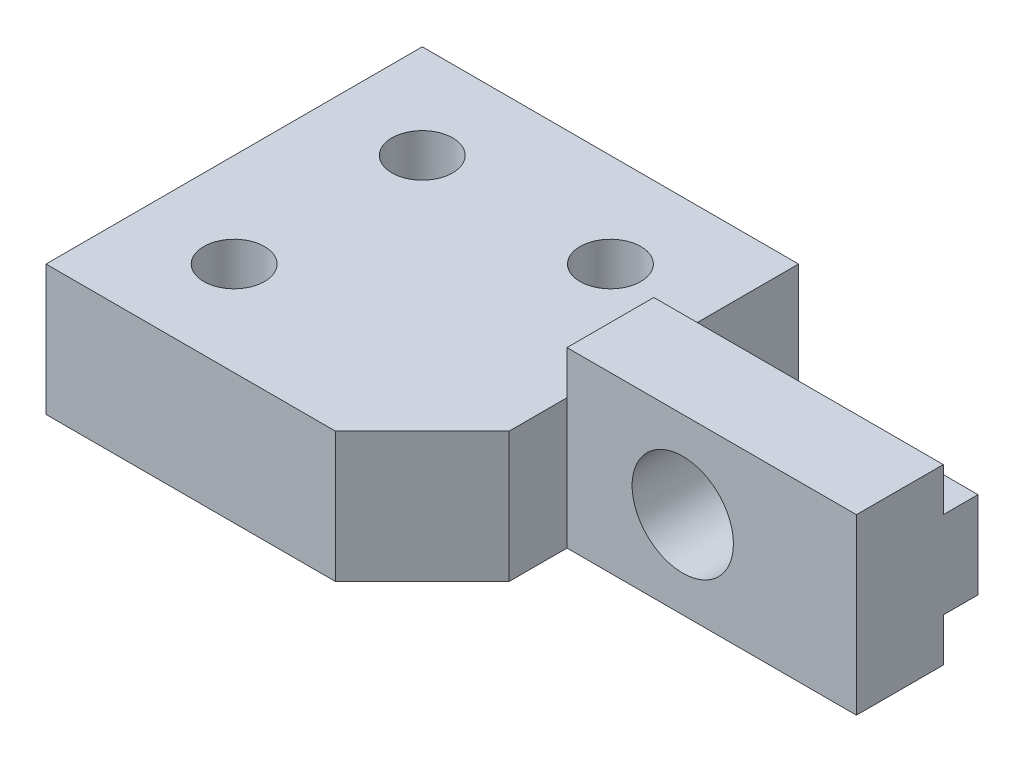
ISO-10303-21;
HEADER;
FILE_DESCRIPTION(('STEP AP214'),'2;1');
FILE_NAME('part.step','',(''),(''),'','','');
FILE_SCHEMA(('AUTOMOTIVE_DESIGN { 1 0 10303 214 1 1 1 1 }'));
ENDSEC;
DATA;
#1=APPLICATION_CONTEXT('core data for automotive mechanical design processes');
#2=APPLICATION_PROTOCOL_DEFINITION('international standard','automotive_design',2000,#1);
#3=PRODUCT_CONTEXT('',#1,'mechanical');
#4=PRODUCT('Part','Part','',(#3));
#5=PRODUCT_RELATED_PRODUCT_CATEGORY('part','',(#4));
#6=PRODUCT_DEFINITION_FORMATION('','',#4);
#7=PRODUCT_DEFINITION_CONTEXT('part definition',#1,'design');
#8=PRODUCT_DEFINITION('design','',#6,#7);
#9=PRODUCT_DEFINITION_SHAPE('','',#8);
#10=(LENGTH_UNIT() NAMED_UNIT(*) SI_UNIT(.MILLI.,.METRE.));
#11=(NAMED_UNIT(*) PLANE_ANGLE_UNIT() SI_UNIT($,.RADIAN.));
#12=(NAMED_UNIT(*) SI_UNIT($,.STERADIAN.) SOLID_ANGLE_UNIT());
#13=UNCERTAINTY_MEASURE_WITH_UNIT(LENGTH_MEASURE(1.E-05),#10,'distance_accuracy_value','');
#14=(GEOMETRIC_REPRESENTATION_CONTEXT(3) GLOBAL_UNCERTAINTY_ASSIGNED_CONTEXT((#13)) GLOBAL_UNIT_ASSIGNED_CONTEXT((#10,
#11,#12)) REPRESENTATION_CONTEXT('',''));
#15=CARTESIAN_POINT('',(0.,0.,0.));
#16=DIRECTION('',(0.,0.,1.));
#17=DIRECTION('',(1.,0.,0.));
#18=AXIS2_PLACEMENT_3D('',#15,#16,#17);
#19=CARTESIAN_POINT('',(16.5,1.5,0.549999999999993));
#20=DIRECTION('',(0.,1.,0.));
#21=DIRECTION('',(0.,0.,1.));
#22=AXIS2_PLACEMENT_3D('',#19,#20,#21);
#23=PLANE('',#22);
#24=DIRECTION('',(-1.,0.,0.));
#25=VECTOR('',#24,1.);
#26=CARTESIAN_POINT('',(16.5,1.5,0.549999999999993));
#27=LINE('',#26,#25);
#28=CARTESIAN_POINT('',(9.598612181134,1.5,0.549999999999993));
#29=VERTEX_POINT('',#28);
#30=CARTESIAN_POINT('',(6.5,1.5,0.549999999999993));
#31=VERTEX_POINT('',#30);
#32=EDGE_CURVE('E63',#29,#31,#27,.T.);
#33=ORIENTED_EDGE('',*,*,#32,.F.);
#34=DIRECTION('',(0.,0.,1.));
#35=VECTOR('',#34,1.);
#36=CARTESIAN_POINT('',(9.598612181134,1.5,-3.25));
#37=LINE('',#36,#35);
#38=CARTESIAN_POINT('',(9.598612181134,1.5,1.74999999999999));
#39=VERTEX_POINT('',#38);
#40=EDGE_CURVE('E332',#29,#39,#37,.T.);
#41=ORIENTED_EDGE('',*,*,#40,.T.);
#42=DIRECTION('',(-1.,0.,0.));
#43=VECTOR('',#42,1.);
#44=CARTESIAN_POINT('',(16.5,1.5,1.74999999999999));
#45=LINE('',#44,#43);
#46=CARTESIAN_POINT('',(6.5,1.5,1.74999999999999));
#47=VERTEX_POINT('',#46);
#48=EDGE_CURVE('E271',#39,#47,#45,.T.);
#49=ORIENTED_EDGE('',*,*,#48,.T.);
#50=DIRECTION('',(0.,0.,-1.));
#51=VECTOR('',#50,1.);
#52=CARTESIAN_POINT('',(6.5,1.5,0.549999999999993));
#53=LINE('',#52,#51);
#54=EDGE_CURVE('E370',#47,#31,#53,.T.);
#55=ORIENTED_EDGE('',*,*,#54,.T.);
#56=EDGE_LOOP('',(#33,#41,#49,#55));
#57=FACE_BOUND('',#56,.T.);
#58=ADVANCED_FACE('F39',(#57),#23,.F.);
#59=CARTESIAN_POINT('',(16.5,4.5,0.549999999999993));
#60=DIRECTION('',(0.,0.,1.));
#61=DIRECTION('',(1.,0.,0.));
#62=AXIS2_PLACEMENT_3D('',#59,#60,#61);
#63=PLANE('',#62);
#64=DIRECTION('',(-1.,0.,0.));
#65=VECTOR('',#64,1.);
#66=CARTESIAN_POINT('',(16.5,4.5,0.549999999999993));
#67=LINE('',#66,#65);
#68=CARTESIAN_POINT('',(9.598612181134,4.5,0.549999999999993));
#69=VERTEX_POINT('',#68);
#70=CARTESIAN_POINT('',(6.5,4.5,0.549999999999993));
#71=VERTEX_POINT('',#70);
#72=EDGE_CURVE('E388',#69,#71,#67,.T.);
#73=ORIENTED_EDGE('',*,*,#72,.F.);
#74=CARTESIAN_POINT('',(10.5,3.,0.549999999999993));
#75=DIRECTION('',(0.,0.,1.));
#76=DIRECTION('',(1.,0.,0.));
#77=AXIS2_PLACEMENT_3D('',#74,#75,#76);
#78=CIRCLE('',#77,1.75);
#79=EDGE_CURVE('E437',#69,#29,#78,.T.);
#80=ORIENTED_EDGE('',*,*,#79,.T.);
#81=ORIENTED_EDGE('',*,*,#32,.T.);
#82=DIRECTION('',(0.,1.,0.));
#83=VECTOR('',#82,1.);
#84=CARTESIAN_POINT('',(6.5,4.5,0.549999999999993));
#85=LINE('',#84,#83);
#86=EDGE_CURVE('E374',#31,#71,#85,.T.);
#87=ORIENTED_EDGE('',*,*,#86,.T.);
#88=EDGE_LOOP('',(#73,#80,#81,#87));
#89=FACE_BOUND('',#88,.T.);
#90=ADVANCED_FACE('F303',(#89),#63,.F.);
#91=CARTESIAN_POINT('',(16.5,4.5,1.74999999999999));
#92=DIRECTION('',(0.,-1.,0.));
#93=DIRECTION('',(0.,0.,-1.));
#94=AXIS2_PLACEMENT_3D('',#91,#92,#93);
#95=PLANE('',#94);
#96=CARTESIAN_POINT('',(16.5,4.5,0.549999999999993));
#97=VERTEX_POINT('',#96);
#98=CARTESIAN_POINT('',(11.401387818866,4.5,0.549999999999993));
#99=VERTEX_POINT('',#98);
#100=EDGE_CURVE('E389',#97,#99,#67,.T.);
#101=ORIENTED_EDGE('',*,*,#100,.T.);
#102=DIRECTION('',(0.,0.,1.));
#103=VECTOR('',#102,1.);
#104=CARTESIAN_POINT('',(11.401387818866,4.5,-3.25));
#105=LINE('',#104,#103);
#106=CARTESIAN_POINT('',(11.401387818866,4.5,1.74999999999999));
#107=VERTEX_POINT('',#106);
#108=EDGE_CURVE('E431',#99,#107,#105,.T.);
#109=ORIENTED_EDGE('',*,*,#108,.T.);
#110=DIRECTION('',(-1.,0.,0.));
#111=VECTOR('',#110,1.);
#112=CARTESIAN_POINT('',(16.5,4.5,1.74999999999999));
#113=LINE('',#112,#111);
#114=CARTESIAN_POINT('',(16.5,4.5,1.74999999999999));
#115=VERTEX_POINT('',#114);
#116=EDGE_CURVE('E384',#115,#107,#113,.T.);
#117=ORIENTED_EDGE('',*,*,#116,.F.);
#118=DIRECTION('',(0.,0.,1.));
#119=VECTOR('',#118,1.);
#120=CARTESIAN_POINT('',(16.5,4.5,1.74999999999999));
#121=LINE('',#120,#119);
#122=EDGE_CURVE('E359',#97,#115,#121,.T.);
#123=ORIENTED_EDGE('',*,*,#122,.F.);
#124=EDGE_LOOP('',(#101,#109,#117,#123));
#125=FACE_BOUND('',#124,.T.);
#126=ADVANCED_FACE('F310',(#125),#95,.F.);
#127=CARTESIAN_POINT('',(6.5,6.,-3.25));
#128=DIRECTION('',(-1.,0.,0.));
#129=DIRECTION('',(0.,0.,1.));
#130=AXIS2_PLACEMENT_3D('',#127,#128,#129);
#131=PLANE('',#130);
#132=DIRECTION('',(0.,-1.,0.));
#133=VECTOR('',#132,1.);
#134=CARTESIAN_POINT('',(6.5,6.,-3.25));
#135=LINE('',#134,#133);
#136=CARTESIAN_POINT('',(6.5,4.5,-3.25));
#137=VERTEX_POINT('',#136);
#138=CARTESIAN_POINT('',(6.5,0.,-3.25));
#139=VERTEX_POINT('',#138);
#140=EDGE_CURVE('E192',#137,#139,#135,.T.);
#141=ORIENTED_EDGE('',*,*,#140,.F.);
#142=DIRECTION('',(0.,0.,-1.));
#143=VECTOR('',#142,1.);
#144=CARTESIAN_POINT('',(6.5,4.5,-3.25));
#145=LINE('',#144,#143);
#146=EDGE_CURVE('E171',#71,#137,#145,.T.);
#147=ORIENTED_EDGE('',*,*,#146,.F.);
#148=ORIENTED_EDGE('',*,*,#86,.F.);
#149=ORIENTED_EDGE('',*,*,#54,.F.);
#150=DIRECTION('',(0.,1.,0.));
#151=VECTOR('',#150,1.);
#152=CARTESIAN_POINT('',(6.5,1.5,1.74999999999999));
#153=LINE('',#152,#151);
#154=CARTESIAN_POINT('',(6.5,0.,1.74999999999999));
#155=VERTEX_POINT('',#154);
#156=EDGE_CURVE('E260',#155,#47,#153,.T.);
#157=ORIENTED_EDGE('',*,*,#156,.F.);
#158=DIRECTION('',(0.,0.,-1.));
#159=VECTOR('',#158,1.);
#160=CARTESIAN_POINT('',(6.5,0.,-3.25));
#161=LINE('',#160,#159);
#162=EDGE_CURVE('E225',#155,#139,#161,.T.);
#163=ORIENTED_EDGE('',*,*,#162,.T.);
#164=EDGE_LOOP('',(#141,#147,#148,#149,#157,#163));
#165=FACE_BOUND('',#164,.T.);
#166=ADVANCED_FACE('F441',(#165),#131,.F.);
#167=DIRECTION('',(0.,-1.,0.));
#168=VECTOR('',#167,1.);
#169=CARTESIAN_POINT('',(6.5,0.,4.75));
#170=LINE('',#169,#168);
#171=CARTESIAN_POINT('',(6.5,4.5,4.75));
#172=VERTEX_POINT('',#171);
#173=CARTESIAN_POINT('',(6.5,0.,4.75));
#174=VERTEX_POINT('',#173);
#175=EDGE_CURVE('E331',#172,#174,#170,.T.);
#176=ORIENTED_EDGE('',*,*,#175,.F.);
#177=CARTESIAN_POINT('',(6.5,4.5,6.75));
#178=VERTEX_POINT('',#177);
#179=EDGE_CURVE('E176',#178,#172,#145,.T.);
#180=ORIENTED_EDGE('',*,*,#179,.F.);
#181=DIRECTION('',(0.,-1.,0.));
#182=VECTOR('',#181,1.);
#183=CARTESIAN_POINT('',(6.5,6.,6.75));
#184=LINE('',#183,#182);
#185=CARTESIAN_POINT('',(6.5,0.,6.75));
#186=VERTEX_POINT('',#185);
#187=EDGE_CURVE('E49',#178,#186,#184,.T.);
#188=ORIENTED_EDGE('',*,*,#187,.T.);
#189=EDGE_CURVE('E209',#186,#174,#161,.T.);
#190=ORIENTED_EDGE('',*,*,#189,.T.);
#191=EDGE_LOOP('',(#176,#180,#188,#190));
#192=FACE_BOUND('',#191,.T.);
#193=ADVANCED_FACE('F208',(#192),#131,.F.);
#194=CARTESIAN_POINT('',(0.,6.,0.));
#195=DIRECTION('',(0.,-1.,0.));
#196=DIRECTION('',(0.,0.,-1.));
#197=AXIS2_PLACEMENT_3D('',#194,#195,#196);
#198=PLANE('',#197);
#199=DIRECTION('',(-1.,0.,0.));
#200=VECTOR('',#199,1.);
#201=CARTESIAN_POINT('',(16.5,6.,1.75));
#202=LINE('',#201,#200);
#203=CARTESIAN_POINT('',(16.5,6.,1.75));
#204=VERTEX_POINT('',#203);
#205=CARTESIAN_POINT('',(6.5,6.,1.75));
#206=VERTEX_POINT('',#205);
#207=EDGE_CURVE('E364',#204,#206,#202,.T.);
#208=ORIENTED_EDGE('',*,*,#207,.T.);
#209=DIRECTION('',(0.,0.,-1.));
#210=VECTOR('',#209,1.);
#211=CARTESIAN_POINT('',(6.5,6.,-3.25));
#212=LINE('',#211,#210);
#213=CARTESIAN_POINT('',(6.5,6.,4.74999999999999));
#214=VERTEX_POINT('',#213);
#215=EDGE_CURVE('E466',#214,#206,#212,.T.);
#216=ORIENTED_EDGE('',*,*,#215,.F.);
#217=DIRECTION('',(-1.,0.,0.));
#218=VECTOR('',#217,1.);
#219=CARTESIAN_POINT('',(16.5,6.,4.75));
#220=LINE('',#219,#218);
#221=CARTESIAN_POINT('',(16.5,6.,4.75));
#222=VERTEX_POINT('',#221);
#223=EDGE_CURVE('E268',#222,#214,#220,.T.);
#224=ORIENTED_EDGE('',*,*,#223,.F.);
#225=DIRECTION('',(0.,0.,1.));
#226=VECTOR('',#225,1.);
#227=CARTESIAN_POINT('',(16.5,6.,4.75));
#228=LINE('',#227,#226);
#229=EDGE_CURVE('E341',#204,#222,#228,.T.);
#230=ORIENTED_EDGE('',*,*,#229,.F.);
#231=EDGE_LOOP('',(#208,#216,#224,#230));
#232=FACE_BOUND('',#231,.T.);
#233=ADVANCED_FACE('F447',(#232),#198,.F.);
#234=CARTESIAN_POINT('',(0.,0.,0.));
#235=DIRECTION('',(0.,-1.,0.));
#236=DIRECTION('',(0.,0.,-1.));
#237=AXIS2_PLACEMENT_3D('',#234,#235,#236);
#238=PLANE('',#237);
#239=CARTESIAN_POINT('',(3.25,0.,0.));
#240=DIRECTION('',(0.,1.,0.));
#241=DIRECTION('',(0.,0.,1.));
#242=AXIS2_PLACEMENT_3D('',#239,#240,#241);
#243=CIRCLE('',#242,1.05);
#244=CARTESIAN_POINT('',(3.25,0.,1.05));
#245=VERTEX_POINT('',#244);
#246=EDGE_CURVE('E236',#245,#245,#243,.T.);
#247=ORIENTED_EDGE('',*,*,#246,.T.);
#248=EDGE_LOOP('',(#247));
#249=FACE_BOUND('',#248,.T.);
#250=DIRECTION('',(0.707106781186548,0.,-0.707106781186547));
#251=VECTOR('',#250,1.);
#252=CARTESIAN_POINT('',(3.5,0.,9.75));
#253=LINE('',#252,#251);
#254=CARTESIAN_POINT('',(3.5,0.,9.75));
#255=VERTEX_POINT('',#254);
#256=EDGE_CURVE('E220',#255,#186,#253,.T.);
#257=ORIENTED_EDGE('',*,*,#256,.F.);
#258=DIRECTION('',(1.,0.,0.));
#259=VECTOR('',#258,1.);
#260=CARTESIAN_POINT('',(-6.5,0.,9.75));
#261=LINE('',#260,#259);
#262=CARTESIAN_POINT('',(-6.5,0.,9.75));
#263=VERTEX_POINT('',#262);
#264=EDGE_CURVE('E245',#263,#255,#261,.T.);
#265=ORIENTED_EDGE('',*,*,#264,.F.);
#266=DIRECTION('',(0.,0.,1.));
#267=VECTOR('',#266,1.);
#268=CARTESIAN_POINT('',(-6.5,0.,-3.25));
#269=LINE('',#268,#267);
#270=CARTESIAN_POINT('',(-6.5,0.,-3.25));
#271=VERTEX_POINT('',#270);
#272=EDGE_CURVE('E242',#271,#263,#269,.T.);
#273=ORIENTED_EDGE('',*,*,#272,.F.);
#274=DIRECTION('',(-1.,0.,0.));
#275=VECTOR('',#274,1.);
#276=CARTESIAN_POINT('',(-6.5,0.,-3.25));
#277=LINE('',#276,#275);
#278=EDGE_CURVE('E189',#139,#271,#277,.T.);
#279=ORIENTED_EDGE('',*,*,#278,.F.);
#280=ORIENTED_EDGE('',*,*,#162,.F.);
#281=DIRECTION('',(-1.,0.,0.));
#282=VECTOR('',#281,1.);
#283=CARTESIAN_POINT('',(16.5,0.,1.74999999999999));
#284=LINE('',#283,#282);
#285=CARTESIAN_POINT('',(16.5,0.,1.74999999999999));
#286=VERTEX_POINT('',#285);
#287=EDGE_CURVE('E253',#286,#155,#284,.T.);
#288=ORIENTED_EDGE('',*,*,#287,.F.);
#289=DIRECTION('',(0.,0.,-1.));
#290=VECTOR('',#289,1.);
#291=CARTESIAN_POINT('',(16.5,0.,1.74999999999999));
#292=LINE('',#291,#290);
#293=CARTESIAN_POINT('',(16.5,0.,4.75));
#294=VERTEX_POINT('',#293);
#295=EDGE_CURVE('E349',#294,#286,#292,.T.);
#296=ORIENTED_EDGE('',*,*,#295,.F.);
#297=DIRECTION('',(-1.,0.,0.));
#298=VECTOR('',#297,1.);
#299=CARTESIAN_POINT('',(16.5,0.,4.75));
#300=LINE('',#299,#298);
#301=EDGE_CURVE('E223',#294,#174,#300,.T.);
#302=ORIENTED_EDGE('',*,*,#301,.T.);
#303=ORIENTED_EDGE('',*,*,#189,.F.);
#304=EDGE_LOOP('',(#257,#265,#273,#279,#280,#288,#296,#302,#303));
#305=FACE_BOUND('',#304,.T.);
#306=CARTESIAN_POINT('',(-3.25,0.,0.));
#307=DIRECTION('',(0.,1.,0.));
#308=DIRECTION('',(0.,0.,1.));
#309=AXIS2_PLACEMENT_3D('',#306,#307,#308);
#310=CIRCLE('',#309,1.05);
#311=CARTESIAN_POINT('',(-3.25,0.,1.05));
#312=VERTEX_POINT('',#311);
#313=EDGE_CURVE('E230',#312,#312,#310,.T.);
#314=ORIENTED_EDGE('',*,*,#313,.T.);
#315=EDGE_LOOP('',(#314));
#316=FACE_BOUND('',#315,.T.);
#317=CARTESIAN_POINT('',(-3.25,0.,6.5));
#318=DIRECTION('',(0.,1.,0.));
#319=DIRECTION('',(0.,0.,1.));
#320=AXIS2_PLACEMENT_3D('',#317,#318,#319);
#321=CIRCLE('',#320,1.05);
#322=CARTESIAN_POINT('',(-3.25,0.,7.55));
#323=VERTEX_POINT('',#322);
#324=EDGE_CURVE('E278',#323,#323,#321,.T.);
#325=ORIENTED_EDGE('',*,*,#324,.T.);
#326=EDGE_LOOP('',(#325));
#327=FACE_BOUND('',#326,.T.);
#328=ADVANCED_FACE('F217',(#249,#305,#316,#327),#238,.T.);
#329=CARTESIAN_POINT('',(3.5,6.,9.75));
#330=DIRECTION('',(-0.707106781186547,0.,-0.707106781186548));
#331=DIRECTION('',(-0.707106781186548,0.,0.707106781186547));
#332=AXIS2_PLACEMENT_3D('',#329,#330,#331);
#333=PLANE('',#332);
#334=ORIENTED_EDGE('',*,*,#187,.F.);
#335=DIRECTION('',(-0.707106781186548,0.,0.707106781186547));
#336=VECTOR('',#335,1.);
#337=CARTESIAN_POINT('',(3.5,4.5,9.75));
#338=LINE('',#337,#336);
#339=CARTESIAN_POINT('',(3.5,4.5,9.75));
#340=VERTEX_POINT('',#339);
#341=EDGE_CURVE('E422',#178,#340,#338,.T.);
#342=ORIENTED_EDGE('',*,*,#341,.T.);
#343=DIRECTION('',(0.,-1.,0.));
#344=VECTOR('',#343,1.);
#345=CARTESIAN_POINT('',(3.5,6.,9.75));
#346=LINE('',#345,#344);
#347=EDGE_CURVE('E197',#340,#255,#346,.T.);
#348=ORIENTED_EDGE('',*,*,#347,.T.);
#349=ORIENTED_EDGE('',*,*,#256,.T.);
#350=EDGE_LOOP('',(#334,#342,#348,#349));
#351=FACE_BOUND('',#350,.T.);
#352=ADVANCED_FACE('F41',(#351),#333,.F.);
#353=CARTESIAN_POINT('',(-6.5,6.,-3.25));
#354=DIRECTION('',(0.,0.,1.));
#355=DIRECTION('',(1.,0.,0.));
#356=AXIS2_PLACEMENT_3D('',#353,#354,#355);
#357=PLANE('',#356);
#358=DIRECTION('',(0.,-1.,0.));
#359=VECTOR('',#358,1.);
#360=CARTESIAN_POINT('',(-6.5,6.,-3.25));
#361=LINE('',#360,#359);
#362=CARTESIAN_POINT('',(-6.5,4.5,-3.25));
#363=VERTEX_POINT('',#362);
#364=EDGE_CURVE('E182',#363,#271,#361,.T.);
#365=ORIENTED_EDGE('',*,*,#364,.F.);
#366=DIRECTION('',(-1.,0.,0.));
#367=VECTOR('',#366,1.);
#368=CARTESIAN_POINT('',(-6.5,4.5,-3.25));
#369=LINE('',#368,#367);
#370=EDGE_CURVE('E163',#137,#363,#369,.T.);
#371=ORIENTED_EDGE('',*,*,#370,.F.);
#372=ORIENTED_EDGE('',*,*,#140,.T.);
#373=ORIENTED_EDGE('',*,*,#278,.T.);
#374=EDGE_LOOP('',(#365,#371,#372,#373));
#375=FACE_BOUND('',#374,.T.);
#376=ADVANCED_FACE('F187',(#375),#357,.F.);
#377=CARTESIAN_POINT('',(-6.5,6.,-3.25));
#378=DIRECTION('',(1.,0.,0.));
#379=DIRECTION('',(0.,0.,-1.));
#380=AXIS2_PLACEMENT_3D('',#377,#378,#379);
#381=PLANE('',#380);
#382=DIRECTION('',(0.,-1.,0.));
#383=VECTOR('',#382,1.);
#384=CARTESIAN_POINT('',(-6.5,6.,9.75));
#385=LINE('',#384,#383);
#386=CARTESIAN_POINT('',(-6.5,4.5,9.75));
#387=VERTEX_POINT('',#386);
#388=EDGE_CURVE('E184',#387,#263,#385,.T.);
#389=ORIENTED_EDGE('',*,*,#388,.F.);
#390=DIRECTION('',(0.,0.,1.));
#391=VECTOR('',#390,1.);
#392=CARTESIAN_POINT('',(-6.5,4.5,-3.25));
#393=LINE('',#392,#391);
#394=EDGE_CURVE('E168',#363,#387,#393,.T.);
#395=ORIENTED_EDGE('',*,*,#394,.F.);
#396=ORIENTED_EDGE('',*,*,#364,.T.);
#397=ORIENTED_EDGE('',*,*,#272,.T.);
#398=EDGE_LOOP('',(#389,#395,#396,#397));
#399=FACE_BOUND('',#398,.T.);
#400=ADVANCED_FACE('F180',(#399),#381,.F.);
#401=CARTESIAN_POINT('',(-6.5,6.,9.75));
#402=DIRECTION('',(0.,0.,-1.));
#403=DIRECTION('',(-1.,0.,0.));
#404=AXIS2_PLACEMENT_3D('',#401,#402,#403);
#405=PLANE('',#404);
#406=ORIENTED_EDGE('',*,*,#347,.F.);
#407=DIRECTION('',(1.,0.,0.));
#408=VECTOR('',#407,1.);
#409=CARTESIAN_POINT('',(-6.5,4.5,9.75));
#410=LINE('',#409,#408);
#411=EDGE_CURVE('E412',#387,#340,#410,.T.);
#412=ORIENTED_EDGE('',*,*,#411,.F.);
#413=ORIENTED_EDGE('',*,*,#388,.T.);
#414=ORIENTED_EDGE('',*,*,#264,.T.);
#415=EDGE_LOOP('',(#406,#412,#413,#414));
#416=FACE_BOUND('',#415,.T.);
#417=ADVANCED_FACE('F249',(#416),#405,.F.);
#418=CARTESIAN_POINT('',(-3.25,6.,0.));
#419=DIRECTION('',(0.,-1.,0.));
#420=DIRECTION('',(0.,0.,-1.));
#421=AXIS2_PLACEMENT_3D('',#418,#419,#420);
#422=CYLINDRICAL_SURFACE('',#421,1.05);
#423=CARTESIAN_POINT('',(-3.25,4.5,0.));
#424=DIRECTION('',(0.,-1.,0.));
#425=DIRECTION('',(0.,0.,-1.));
#426=AXIS2_PLACEMENT_3D('',#423,#424,#425);
#427=CIRCLE('',#426,1.05);
#428=CARTESIAN_POINT('',(-3.25,4.5,-1.05));
#429=VERTEX_POINT('',#428);
#430=EDGE_CURVE('E418',#429,#429,#427,.T.);
#431=ORIENTED_EDGE('',*,*,#430,.F.);
#432=EDGE_LOOP('',(#431));
#433=FACE_BOUND('',#432,.T.);
#434=ORIENTED_EDGE('',*,*,#313,.F.);
#435=EDGE_LOOP('',(#434));
#436=FACE_BOUND('',#435,.T.);
#437=ADVANCED_FACE('F289',(#433,#436),#422,.F.);
#438=CARTESIAN_POINT('',(3.25,6.,0.));
#439=DIRECTION('',(0.,-1.,0.));
#440=DIRECTION('',(0.,0.,-1.));
#441=AXIS2_PLACEMENT_3D('',#438,#439,#440);
#442=CYLINDRICAL_SURFACE('',#441,1.05);
#443=CARTESIAN_POINT('',(3.25,4.5,0.));
#444=DIRECTION('',(0.,-1.,0.));
#445=DIRECTION('',(0.,0.,-1.));
#446=AXIS2_PLACEMENT_3D('',#443,#444,#445);
#447=CIRCLE('',#446,1.05);
#448=CARTESIAN_POINT('',(3.25,4.5,-1.05));
#449=VERTEX_POINT('',#448);
#450=EDGE_CURVE('E414',#449,#449,#447,.T.);
#451=ORIENTED_EDGE('',*,*,#450,.F.);
#452=EDGE_LOOP('',(#451));
#453=FACE_BOUND('',#452,.T.);
#454=ORIENTED_EDGE('',*,*,#246,.F.);
#455=EDGE_LOOP('',(#454));
#456=FACE_BOUND('',#455,.T.);
#457=ADVANCED_FACE('F286',(#453,#456),#442,.F.);
#458=CARTESIAN_POINT('',(-3.25,6.,6.5));
#459=DIRECTION('',(0.,-1.,0.));
#460=DIRECTION('',(0.,0.,-1.));
#461=AXIS2_PLACEMENT_3D('',#458,#459,#460);
#462=CYLINDRICAL_SURFACE('',#461,1.05);
#463=CARTESIAN_POINT('',(-3.25,4.5,6.5));
#464=DIRECTION('',(0.,-1.,0.));
#465=DIRECTION('',(0.,0.,-1.));
#466=AXIS2_PLACEMENT_3D('',#463,#464,#465);
#467=CIRCLE('',#466,1.05);
#468=CARTESIAN_POINT('',(-3.25,4.5,5.45));
#469=VERTEX_POINT('',#468);
#470=EDGE_CURVE('E43',#469,#469,#467,.T.);
#471=ORIENTED_EDGE('',*,*,#470,.F.);
#472=EDGE_LOOP('',(#471));
#473=FACE_BOUND('',#472,.T.);
#474=ORIENTED_EDGE('',*,*,#324,.F.);
#475=EDGE_LOOP('',(#474));
#476=FACE_BOUND('',#475,.T.);
#477=ADVANCED_FACE('F288',(#473,#476),#462,.F.);
#478=CARTESIAN_POINT('',(16.5,0.,4.75));
#479=DIRECTION('',(0.,0.,-1.));
#480=DIRECTION('',(-1.,0.,0.));
#481=AXIS2_PLACEMENT_3D('',#478,#479,#480);
#482=PLANE('',#481);
#483=CARTESIAN_POINT('',(10.5,3.,4.75));
#484=DIRECTION('',(0.,0.,1.));
#485=DIRECTION('',(1.,0.,0.));
#486=AXIS2_PLACEMENT_3D('',#483,#484,#485);
#487=CIRCLE('',#486,1.75);
#488=CARTESIAN_POINT('',(12.25,3.,4.75));
#489=VERTEX_POINT('',#488);
#490=EDGE_CURVE('E425',#489,#489,#487,.T.);
#491=ORIENTED_EDGE('',*,*,#490,.F.);
#492=EDGE_LOOP('',(#491));
#493=FACE_BOUND('',#492,.T.);
#494=EDGE_CURVE('E336',#214,#172,#170,.T.);
#495=ORIENTED_EDGE('',*,*,#494,.T.);
#496=ORIENTED_EDGE('',*,*,#175,.T.);
#497=ORIENTED_EDGE('',*,*,#301,.F.);
#498=DIRECTION('',(0.,-1.,0.));
#499=VECTOR('',#498,1.);
#500=CARTESIAN_POINT('',(16.5,0.,4.75));
#501=LINE('',#500,#499);
#502=EDGE_CURVE('E345',#222,#294,#501,.T.);
#503=ORIENTED_EDGE('',*,*,#502,.F.);
#504=ORIENTED_EDGE('',*,*,#223,.T.);
#505=EDGE_LOOP('',(#495,#496,#497,#503,#504));
#506=FACE_BOUND('',#505,.T.);
#507=ADVANCED_FACE('F296',(#493,#506),#482,.F.);
#508=CARTESIAN_POINT('',(16.5,1.5,1.74999999999999));
#509=DIRECTION('',(0.,0.,1.));
#510=DIRECTION('',(1.,0.,0.));
#511=AXIS2_PLACEMENT_3D('',#508,#509,#510);
#512=PLANE('',#511);
#513=ORIENTED_EDGE('',*,*,#48,.F.);
#514=CARTESIAN_POINT('',(10.5,3.,1.74999999999999));
#515=DIRECTION('',(0.,0.,1.));
#516=DIRECTION('',(1.,0.,0.));
#517=AXIS2_PLACEMENT_3D('',#514,#515,#516);
#518=CIRCLE('',#517,1.75);
#519=CARTESIAN_POINT('',(11.401387818866,1.5,1.74999999999999));
#520=VERTEX_POINT('',#519);
#521=EDGE_CURVE('E328',#39,#520,#518,.T.);
#522=ORIENTED_EDGE('',*,*,#521,.T.);
#523=CARTESIAN_POINT('',(16.5,1.5,1.74999999999999));
#524=VERTEX_POINT('',#523);
#525=EDGE_CURVE('E264',#524,#520,#45,.T.);
#526=ORIENTED_EDGE('',*,*,#525,.F.);
#527=DIRECTION('',(0.,1.,0.));
#528=VECTOR('',#527,1.);
#529=CARTESIAN_POINT('',(16.5,1.5,1.74999999999999));
#530=LINE('',#529,#528);
#531=EDGE_CURVE('E262',#286,#524,#530,.T.);
#532=ORIENTED_EDGE('',*,*,#531,.F.);
#533=ORIENTED_EDGE('',*,*,#287,.T.);
#534=ORIENTED_EDGE('',*,*,#156,.T.);
#535=EDGE_LOOP('',(#513,#522,#526,#532,#533,#534));
#536=FACE_BOUND('',#535,.T.);
#537=ADVANCED_FACE('F259',(#536),#512,.F.);
#538=ORIENTED_EDGE('',*,*,#525,.T.);
#539=DIRECTION('',(0.,0.,1.));
#540=VECTOR('',#539,1.);
#541=CARTESIAN_POINT('',(11.401387818866,1.5,-3.25));
#542=LINE('',#541,#540);
#543=CARTESIAN_POINT('',(11.401387818866,1.5,0.549999999999993));
#544=VERTEX_POINT('',#543);
#545=EDGE_CURVE('E324',#520,#544,#542,.F.);
#546=ORIENTED_EDGE('',*,*,#545,.T.);
#547=CARTESIAN_POINT('',(16.5,1.5,0.549999999999993));
#548=VERTEX_POINT('',#547);
#549=EDGE_CURVE('E392',#548,#544,#27,.T.);
#550=ORIENTED_EDGE('',*,*,#549,.F.);
#551=DIRECTION('',(0.,0.,-1.));
#552=VECTOR('',#551,1.);
#553=CARTESIAN_POINT('',(16.5,1.5,0.549999999999993));
#554=LINE('',#553,#552);
#555=EDGE_CURVE('E326',#524,#548,#554,.T.);
#556=ORIENTED_EDGE('',*,*,#555,.F.);
#557=EDGE_LOOP('',(#538,#546,#550,#556));
#558=FACE_BOUND('',#557,.T.);
#559=ADVANCED_FACE('F306',(#558),#23,.F.);
#560=ORIENTED_EDGE('',*,*,#549,.T.);
#561=EDGE_CURVE('E435',#544,#99,#78,.T.);
#562=ORIENTED_EDGE('',*,*,#561,.T.);
#563=ORIENTED_EDGE('',*,*,#100,.F.);
#564=DIRECTION('',(0.,1.,0.));
#565=VECTOR('',#564,1.);
#566=CARTESIAN_POINT('',(16.5,4.5,0.549999999999993));
#567=LINE('',#566,#565);
#568=EDGE_CURVE('E356',#548,#97,#567,.T.);
#569=ORIENTED_EDGE('',*,*,#568,.F.);
#570=EDGE_LOOP('',(#560,#562,#563,#569));
#571=FACE_BOUND('',#570,.T.);
#572=ADVANCED_FACE('F312',(#571),#63,.F.);
#573=CARTESIAN_POINT('',(9.598612181134,4.5,1.74999999999999));
#574=VERTEX_POINT('',#573);
#575=CARTESIAN_POINT('',(6.5,4.5,1.75));
#576=VERTEX_POINT('',#575);
#577=EDGE_CURVE('E383',#574,#576,#113,.T.);
#578=ORIENTED_EDGE('',*,*,#577,.F.);
#579=DIRECTION('',(0.,0.,1.));
#580=VECTOR('',#579,1.);
#581=CARTESIAN_POINT('',(9.598612181134,4.5,-3.25));
#582=LINE('',#581,#580);
#583=EDGE_CURVE('E56',#574,#69,#582,.F.);
#584=ORIENTED_EDGE('',*,*,#583,.T.);
#585=ORIENTED_EDGE('',*,*,#72,.T.);
#586=ORIENTED_EDGE('',*,*,#146,.T.);
#587=ORIENTED_EDGE('',*,*,#370,.T.);
#588=ORIENTED_EDGE('',*,*,#394,.T.);
#589=ORIENTED_EDGE('',*,*,#411,.T.);
#590=ORIENTED_EDGE('',*,*,#341,.F.);
#591=ORIENTED_EDGE('',*,*,#179,.T.);
#592=EDGE_CURVE('E406',#172,#576,#145,.T.);
#593=ORIENTED_EDGE('',*,*,#592,.T.);
#594=EDGE_LOOP('',(#578,#584,#585,#586,#587,#588,#589,#590,#591,#593));
#595=FACE_BOUND('',#594,.T.);
#596=ORIENTED_EDGE('',*,*,#430,.T.);
#597=EDGE_LOOP('',(#596));
#598=FACE_BOUND('',#597,.T.);
#599=ORIENTED_EDGE('',*,*,#450,.T.);
#600=EDGE_LOOP('',(#599));
#601=FACE_BOUND('',#600,.T.);
#602=ORIENTED_EDGE('',*,*,#470,.T.);
#603=EDGE_LOOP('',(#602));
#604=FACE_BOUND('',#603,.T.);
#605=ADVANCED_FACE('F166',(#595,#598,#601,#604),#95,.F.);
#606=CARTESIAN_POINT('',(16.5,6.,1.75));
#607=DIRECTION('',(0.,0.,1.));
#608=DIRECTION('',(0.,-1.,0.));
#609=AXIS2_PLACEMENT_3D('',#606,#607,#608);
#610=PLANE('',#609);
#611=ORIENTED_EDGE('',*,*,#116,.T.);
#612=CARTESIAN_POINT('',(10.5,3.,1.74999999999999));
#613=DIRECTION('',(0.,0.,1.));
#614=DIRECTION('',(0.,-1.,0.));
#615=AXIS2_PLACEMENT_3D('',#612,#613,#614);
#616=CIRCLE('',#615,1.75);
#617=EDGE_CURVE('E11',#107,#574,#616,.T.);
#618=ORIENTED_EDGE('',*,*,#617,.T.);
#619=ORIENTED_EDGE('',*,*,#577,.T.);
#620=DIRECTION('',(0.,1.,0.));
#621=VECTOR('',#620,1.);
#622=CARTESIAN_POINT('',(6.5,6.,1.75));
#623=LINE('',#622,#621);
#624=EDGE_CURVE('E346',#576,#206,#623,.T.);
#625=ORIENTED_EDGE('',*,*,#624,.T.);
#626=ORIENTED_EDGE('',*,*,#207,.F.);
#627=DIRECTION('',(0.,1.,0.));
#628=VECTOR('',#627,1.);
#629=CARTESIAN_POINT('',(16.5,6.,1.75));
#630=LINE('',#629,#628);
#631=EDGE_CURVE('E362',#115,#204,#630,.T.);
#632=ORIENTED_EDGE('',*,*,#631,.F.);
#633=EDGE_LOOP('',(#611,#618,#619,#625,#626,#632));
#634=FACE_BOUND('',#633,.T.);
#635=ADVANCED_FACE('F402',(#634),#610,.F.);
#636=CARTESIAN_POINT('',(16.5,0.,0.));
#637=DIRECTION('',(-1.,0.,0.));
#638=DIRECTION('',(0.,0.,1.));
#639=AXIS2_PLACEMENT_3D('',#636,#637,#638);
#640=PLANE('',#639);
#641=ORIENTED_EDGE('',*,*,#229,.T.);
#642=ORIENTED_EDGE('',*,*,#502,.T.);
#643=ORIENTED_EDGE('',*,*,#295,.T.);
#644=ORIENTED_EDGE('',*,*,#531,.T.);
#645=ORIENTED_EDGE('',*,*,#555,.T.);
#646=ORIENTED_EDGE('',*,*,#568,.T.);
#647=ORIENTED_EDGE('',*,*,#122,.T.);
#648=ORIENTED_EDGE('',*,*,#631,.T.);
#649=EDGE_LOOP('',(#641,#642,#643,#644,#645,#646,#647,#648));
#650=FACE_BOUND('',#649,.T.);
#651=ADVANCED_FACE('F470',(#650),#640,.F.);
#652=CARTESIAN_POINT('',(10.5,3.,-3.25));
#653=DIRECTION('',(0.,0.,1.));
#654=DIRECTION('',(1.,0.,0.));
#655=AXIS2_PLACEMENT_3D('',#652,#653,#654);
#656=CYLINDRICAL_SURFACE('',#655,1.75);
#657=ORIENTED_EDGE('',*,*,#490,.T.);
#658=EDGE_LOOP('',(#657));
#659=FACE_BOUND('',#658,.T.);
#660=ORIENTED_EDGE('',*,*,#40,.F.);
#661=ORIENTED_EDGE('',*,*,#79,.F.);
#662=ORIENTED_EDGE('',*,*,#583,.F.);
#663=ORIENTED_EDGE('',*,*,#617,.F.);
#664=ORIENTED_EDGE('',*,*,#108,.F.);
#665=ORIENTED_EDGE('',*,*,#561,.F.);
#666=ORIENTED_EDGE('',*,*,#545,.F.);
#667=ORIENTED_EDGE('',*,*,#521,.F.);
#668=EDGE_LOOP('',(#660,#661,#662,#663,#664,#665,#666,#667));
#669=FACE_BOUND('',#668,.T.);
#670=ADVANCED_FACE('F473',(#659,#669),#656,.F.);
#671=CARTESIAN_POINT('',(6.5,-13.8847763108502,-3.25));
#672=DIRECTION('',(1.,0.,0.));
#673=DIRECTION('',(0.,0.,-1.));
#674=AXIS2_PLACEMENT_3D('',#671,#672,#673);
#675=PLANE('',#674);
#676=ORIENTED_EDGE('',*,*,#215,.T.);
#677=ORIENTED_EDGE('',*,*,#624,.F.);
#678=ORIENTED_EDGE('',*,*,#592,.F.);
#679=ORIENTED_EDGE('',*,*,#494,.F.);
#680=EDGE_LOOP('',(#676,#677,#678,#679));
#681=FACE_BOUND('',#680,.T.);
#682=ADVANCED_FACE('F475',(#681),#675,.F.);
#683=CLOSED_SHELL('',(#58,#90,#126,#166,#193,#233,#328,#352,#376,#400,#417,#437,#457,#477,#507,
#537,#559,#572,#605,#635,#651,#670,#682));
#684=MANIFOLD_SOLID_BREP('B2',#683);
#685=ADVANCED_BREP_SHAPE_REPRESENTATION('',(#18,#684),#14);
#686=SHAPE_DEFINITION_REPRESENTATION(#9,#685);
ENDSEC;
END-ISO-10303-21;
